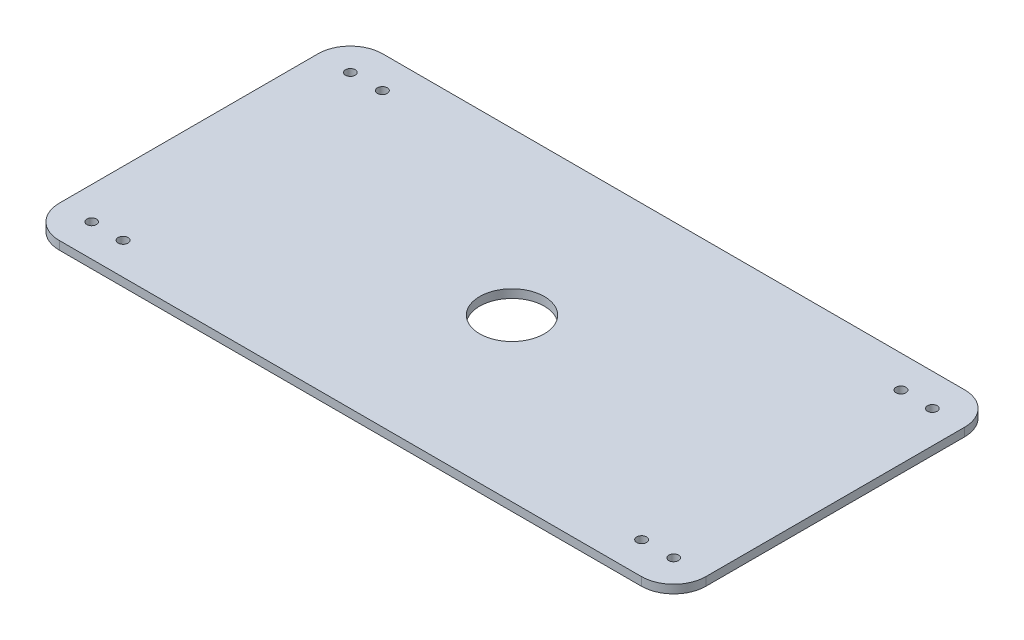
ISO-10303-21;
HEADER;
FILE_DESCRIPTION(('STEP AP214'),'2;1');
FILE_NAME('part.step','',(''),(''),'','','');
FILE_SCHEMA(('AUTOMOTIVE_DESIGN { 1 0 10303 214 1 1 1 1 }'));
ENDSEC;
DATA;
#1=APPLICATION_CONTEXT('core data for automotive mechanical design processes');
#2=APPLICATION_PROTOCOL_DEFINITION('international standard','automotive_design',2000,#1);
#3=PRODUCT_CONTEXT('',#1,'mechanical');
#4=PRODUCT('Part','Part','',(#3));
#5=PRODUCT_RELATED_PRODUCT_CATEGORY('part','',(#4));
#6=PRODUCT_DEFINITION_FORMATION('','',#4);
#7=PRODUCT_DEFINITION_CONTEXT('part definition',#1,'design');
#8=PRODUCT_DEFINITION('design','',#6,#7);
#9=PRODUCT_DEFINITION_SHAPE('','',#8);
#10=(LENGTH_UNIT() NAMED_UNIT(*) SI_UNIT(.MILLI.,.METRE.));
#11=(NAMED_UNIT(*) PLANE_ANGLE_UNIT() SI_UNIT($,.RADIAN.));
#12=(NAMED_UNIT(*) SI_UNIT($,.STERADIAN.) SOLID_ANGLE_UNIT());
#13=UNCERTAINTY_MEASURE_WITH_UNIT(LENGTH_MEASURE(1.E-05),#10,'distance_accuracy_value','');
#14=(GEOMETRIC_REPRESENTATION_CONTEXT(3) GLOBAL_UNCERTAINTY_ASSIGNED_CONTEXT((#13)) GLOBAL_UNIT_ASSIGNED_CONTEXT((#10,
#11,#12)) REPRESENTATION_CONTEXT('',''));
#15=CARTESIAN_POINT('',(0.,0.,0.));
#16=DIRECTION('',(0.,0.,1.));
#17=DIRECTION('',(1.,0.,0.));
#18=AXIS2_PLACEMENT_3D('',#15,#16,#17);
#19=CARTESIAN_POINT('',(0.,2.6,0.));
#20=DIRECTION('',(1.,0.,0.));
#21=DIRECTION('',(0.,0.,-1.));
#22=AXIS2_PLACEMENT_3D('',#19,#20,#21);
#23=PLANE('',#22);
#24=DIRECTION('',(0.,0.,1.));
#25=VECTOR('',#24,1.);
#26=CARTESIAN_POINT('',(0.,2.6,0.));
#27=LINE('',#26,#25);
#28=CARTESIAN_POINT('',(0.,2.6,10.));
#29=VERTEX_POINT('',#28);
#30=CARTESIAN_POINT('',(0.,2.6,90.));
#31=VERTEX_POINT('',#30);
#32=EDGE_CURVE('E120',#29,#31,#27,.T.);
#33=ORIENTED_EDGE('',*,*,#32,.F.);
#34=DIRECTION('',(0.,-1.,0.));
#35=VECTOR('',#34,1.);
#36=CARTESIAN_POINT('',(0.,0.,10.));
#37=LINE('',#36,#35);
#38=CARTESIAN_POINT('',(0.,0.,10.));
#39=VERTEX_POINT('',#38);
#40=EDGE_CURVE('E105',#29,#39,#37,.T.);
#41=ORIENTED_EDGE('',*,*,#40,.T.);
#42=DIRECTION('',(0.,0.,1.));
#43=VECTOR('',#42,1.);
#44=CARTESIAN_POINT('',(0.,0.,0.));
#45=LINE('',#44,#43);
#46=CARTESIAN_POINT('',(0.,0.,90.));
#47=VERTEX_POINT('',#46);
#48=EDGE_CURVE('E117',#39,#47,#45,.T.);
#49=ORIENTED_EDGE('',*,*,#48,.T.);
#50=DIRECTION('',(0.,-1.,0.));
#51=VECTOR('',#50,1.);
#52=CARTESIAN_POINT('',(0.,2.6,90.));
#53=LINE('',#52,#51);
#54=EDGE_CURVE('E122',#47,#31,#53,.F.);
#55=ORIENTED_EDGE('',*,*,#54,.T.);
#56=EDGE_LOOP('',(#33,#41,#49,#55));
#57=FACE_BOUND('',#56,.T.);
#58=ADVANCED_FACE('F35',(#57),#23,.F.);
#59=CARTESIAN_POINT('',(0.,2.6,100.));
#60=DIRECTION('',(0.,0.,-1.));
#61=DIRECTION('',(-1.,0.,0.));
#62=AXIS2_PLACEMENT_3D('',#59,#60,#61);
#63=PLANE('',#62);
#64=DIRECTION('',(1.,0.,0.));
#65=VECTOR('',#64,1.);
#66=CARTESIAN_POINT('',(0.,2.6,100.));
#67=LINE('',#66,#65);
#68=CARTESIAN_POINT('',(10.,2.6,100.));
#69=VERTEX_POINT('',#68);
#70=CARTESIAN_POINT('',(190.,2.6,100.));
#71=VERTEX_POINT('',#70);
#72=EDGE_CURVE('E167',#69,#71,#67,.T.);
#73=ORIENTED_EDGE('',*,*,#72,.F.);
#74=DIRECTION('',(0.,-1.,0.));
#75=VECTOR('',#74,1.);
#76=CARTESIAN_POINT('',(10.,2.6,100.));
#77=LINE('',#76,#75);
#78=CARTESIAN_POINT('',(10.,0.,100.));
#79=VERTEX_POINT('',#78);
#80=EDGE_CURVE('E160',#69,#79,#77,.T.);
#81=ORIENTED_EDGE('',*,*,#80,.T.);
#82=DIRECTION('',(1.,0.,0.));
#83=VECTOR('',#82,1.);
#84=CARTESIAN_POINT('',(0.,0.,100.));
#85=LINE('',#84,#83);
#86=CARTESIAN_POINT('',(190.,0.,100.));
#87=VERTEX_POINT('',#86);
#88=EDGE_CURVE('E126',#79,#87,#85,.T.);
#89=ORIENTED_EDGE('',*,*,#88,.T.);
#90=DIRECTION('',(0.,-1.,0.));
#91=VECTOR('',#90,1.);
#92=CARTESIAN_POINT('',(190.,2.6,100.));
#93=LINE('',#92,#91);
#94=EDGE_CURVE('E158',#87,#71,#93,.F.);
#95=ORIENTED_EDGE('',*,*,#94,.T.);
#96=EDGE_LOOP('',(#73,#81,#89,#95));
#97=FACE_BOUND('',#96,.T.);
#98=ADVANCED_FACE('F165',(#97),#63,.F.);
#99=CARTESIAN_POINT('',(200.,2.6,0.));
#100=DIRECTION('',(1.,0.,0.));
#101=DIRECTION('',(0.,0.,-1.));
#102=AXIS2_PLACEMENT_3D('',#99,#100,#101);
#103=PLANE('',#102);
#104=DIRECTION('',(0.,0.,1.));
#105=VECTOR('',#104,1.);
#106=CARTESIAN_POINT('',(200.,2.6,0.));
#107=LINE('',#106,#105);
#108=CARTESIAN_POINT('',(200.,2.6,10.));
#109=VERTEX_POINT('',#108);
#110=CARTESIAN_POINT('',(200.,2.6,90.));
#111=VERTEX_POINT('',#110);
#112=EDGE_CURVE('E174',#109,#111,#107,.T.);
#113=ORIENTED_EDGE('',*,*,#112,.T.);
#114=DIRECTION('',(0.,-1.,0.));
#115=VECTOR('',#114,1.);
#116=CARTESIAN_POINT('',(200.,0.,90.));
#117=LINE('',#116,#115);
#118=CARTESIAN_POINT('',(200.,0.,90.));
#119=VERTEX_POINT('',#118);
#120=EDGE_CURVE('E11',#111,#119,#117,.T.);
#121=ORIENTED_EDGE('',*,*,#120,.T.);
#122=DIRECTION('',(0.,0.,1.));
#123=VECTOR('',#122,1.);
#124=CARTESIAN_POINT('',(200.,0.,0.));
#125=LINE('',#124,#123);
#126=CARTESIAN_POINT('',(200.,0.,10.));
#127=VERTEX_POINT('',#126);
#128=EDGE_CURVE('E130',#127,#119,#125,.T.);
#129=ORIENTED_EDGE('',*,*,#128,.F.);
#130=DIRECTION('',(0.,-1.,0.));
#131=VECTOR('',#130,1.);
#132=CARTESIAN_POINT('',(200.,2.6,10.));
#133=LINE('',#132,#131);
#134=EDGE_CURVE('E43',#127,#109,#133,.F.);
#135=ORIENTED_EDGE('',*,*,#134,.T.);
#136=EDGE_LOOP('',(#113,#121,#129,#135));
#137=FACE_BOUND('',#136,.T.);
#138=ADVANCED_FACE('F173',(#137),#103,.T.);
#139=CARTESIAN_POINT('',(0.,2.6,0.));
#140=DIRECTION('',(0.,0.,-1.));
#141=DIRECTION('',(-1.,0.,0.));
#142=AXIS2_PLACEMENT_3D('',#139,#140,#141);
#143=PLANE('',#142);
#144=DIRECTION('',(1.,0.,0.));
#145=VECTOR('',#144,1.);
#146=CARTESIAN_POINT('',(0.,0.,0.));
#147=LINE('',#146,#145);
#148=CARTESIAN_POINT('',(10.,0.,0.));
#149=VERTEX_POINT('',#148);
#150=CARTESIAN_POINT('',(190.,0.,0.));
#151=VERTEX_POINT('',#150);
#152=EDGE_CURVE('E141',#149,#151,#147,.T.);
#153=ORIENTED_EDGE('',*,*,#152,.F.);
#154=DIRECTION('',(0.,-1.,0.));
#155=VECTOR('',#154,1.);
#156=CARTESIAN_POINT('',(10.,2.6,0.));
#157=LINE('',#156,#155);
#158=CARTESIAN_POINT('',(10.,2.6,0.));
#159=VERTEX_POINT('',#158);
#160=EDGE_CURVE('E106',#149,#159,#157,.F.);
#161=ORIENTED_EDGE('',*,*,#160,.T.);
#162=DIRECTION('',(1.,0.,0.));
#163=VECTOR('',#162,1.);
#164=CARTESIAN_POINT('',(0.,2.6,0.));
#165=LINE('',#164,#163);
#166=CARTESIAN_POINT('',(190.,2.6,0.));
#167=VERTEX_POINT('',#166);
#168=EDGE_CURVE('E136',#159,#167,#165,.T.);
#169=ORIENTED_EDGE('',*,*,#168,.T.);
#170=DIRECTION('',(0.,-1.,0.));
#171=VECTOR('',#170,1.);
#172=CARTESIAN_POINT('',(190.,2.6,0.));
#173=LINE('',#172,#171);
#174=EDGE_CURVE('E111',#167,#151,#173,.T.);
#175=ORIENTED_EDGE('',*,*,#174,.T.);
#176=EDGE_LOOP('',(#153,#161,#169,#175));
#177=FACE_BOUND('',#176,.T.);
#178=ADVANCED_FACE('F361',(#177),#143,.T.);
#179=CARTESIAN_POINT('',(0.,2.6,0.));
#180=DIRECTION('',(0.,1.,0.));
#181=DIRECTION('',(0.,0.,1.));
#182=AXIS2_PLACEMENT_3D('',#179,#180,#181);
#183=PLANE('',#182);
#184=CARTESIAN_POINT('',(19.812,2.6,90.094));
#185=DIRECTION('',(0.,-1.,0.));
#186=DIRECTION('',(0.,0.,-1.));
#187=AXIS2_PLACEMENT_3D('',#184,#185,#186);
#188=CIRCLE('',#187,1.524);
#189=CARTESIAN_POINT('',(19.812,2.6,88.57));
#190=VERTEX_POINT('',#189);
#191=EDGE_CURVE('E225',#190,#190,#188,.T.);
#192=ORIENTED_EDGE('',*,*,#191,.T.);
#193=EDGE_LOOP('',(#192));
#194=FACE_BOUND('',#193,.T.);
#195=CARTESIAN_POINT('',(180.188,2.6,90.094));
#196=DIRECTION('',(0.,1.,0.));
#197=DIRECTION('',(0.,0.,-1.));
#198=AXIS2_PLACEMENT_3D('',#195,#196,#197);
#199=CIRCLE('',#198,1.524);
#200=CARTESIAN_POINT('',(180.188,2.6,88.57));
#201=VERTEX_POINT('',#200);
#202=EDGE_CURVE('E219',#201,#201,#199,.T.);
#203=ORIENTED_EDGE('',*,*,#202,.F.);
#204=EDGE_LOOP('',(#203));
#205=FACE_BOUND('',#204,.T.);
#206=CARTESIAN_POINT('',(180.188,2.6,9.90599999999999));
#207=DIRECTION('',(0.,-1.,0.));
#208=DIRECTION('',(0.,0.,1.));
#209=AXIS2_PLACEMENT_3D('',#206,#207,#208);
#210=CIRCLE('',#209,1.524);
#211=CARTESIAN_POINT('',(180.188,2.6,11.43));
#212=VERTEX_POINT('',#211);
#213=EDGE_CURVE('E213',#212,#212,#210,.T.);
#214=ORIENTED_EDGE('',*,*,#213,.T.);
#215=EDGE_LOOP('',(#214));
#216=FACE_BOUND('',#215,.T.);
#217=CARTESIAN_POINT('',(19.812,2.6,9.906));
#218=DIRECTION('',(0.,1.,0.));
#219=DIRECTION('',(0.,0.,1.));
#220=AXIS2_PLACEMENT_3D('',#217,#218,#219);
#221=CIRCLE('',#220,1.524);
#222=CARTESIAN_POINT('',(19.812,2.6,11.43));
#223=VERTEX_POINT('',#222);
#224=EDGE_CURVE('E207',#223,#223,#221,.T.);
#225=ORIENTED_EDGE('',*,*,#224,.F.);
#226=EDGE_LOOP('',(#225));
#227=FACE_BOUND('',#226,.T.);
#228=CARTESIAN_POINT('',(100.,2.6,50.));
#229=DIRECTION('',(0.,-1.,0.));
#230=DIRECTION('',(0.,0.,-1.));
#231=AXIS2_PLACEMENT_3D('',#228,#229,#230);
#232=CIRCLE('',#231,9.99999999999999);
#233=CARTESIAN_POINT('',(100.,2.6,40.));
#234=VERTEX_POINT('',#233);
#235=EDGE_CURVE('E198',#234,#234,#232,.T.);
#236=ORIENTED_EDGE('',*,*,#235,.T.);
#237=EDGE_LOOP('',(#236));
#238=FACE_BOUND('',#237,.T.);
#239=CARTESIAN_POINT('',(190.,2.6,90.));
#240=DIRECTION('',(0.,1.,0.));
#241=DIRECTION('',(0.,0.,1.));
#242=AXIS2_PLACEMENT_3D('',#239,#240,#241);
#243=CIRCLE('',#242,1.5);
#244=CARTESIAN_POINT('',(190.,2.6,91.5));
#245=VERTEX_POINT('',#244);
#246=EDGE_CURVE('E192',#245,#245,#243,.T.);
#247=ORIENTED_EDGE('',*,*,#246,.F.);
#248=EDGE_LOOP('',(#247));
#249=FACE_BOUND('',#248,.T.);
#250=CARTESIAN_POINT('',(10.,2.6,90.));
#251=DIRECTION('',(0.,-1.,0.));
#252=DIRECTION('',(0.,0.,1.));
#253=AXIS2_PLACEMENT_3D('',#250,#251,#252);
#254=CIRCLE('',#253,1.5);
#255=CARTESIAN_POINT('',(10.,2.6,91.5));
#256=VERTEX_POINT('',#255);
#257=EDGE_CURVE('E186',#256,#256,#254,.T.);
#258=ORIENTED_EDGE('',*,*,#257,.T.);
#259=EDGE_LOOP('',(#258));
#260=FACE_BOUND('',#259,.T.);
#261=CARTESIAN_POINT('',(10.,2.6,10.));
#262=DIRECTION('',(0.,1.,0.));
#263=DIRECTION('',(0.,0.,-1.));
#264=AXIS2_PLACEMENT_3D('',#261,#262,#263);
#265=CIRCLE('',#264,1.5);
#266=CARTESIAN_POINT('',(10.,2.6,8.50000000000001));
#267=VERTEX_POINT('',#266);
#268=EDGE_CURVE('E181',#267,#267,#265,.T.);
#269=ORIENTED_EDGE('',*,*,#268,.F.);
#270=EDGE_LOOP('',(#269));
#271=FACE_BOUND('',#270,.T.);
#272=CARTESIAN_POINT('',(190.,2.6,10.));
#273=DIRECTION('',(0.,-1.,0.));
#274=DIRECTION('',(0.,0.,-1.));
#275=AXIS2_PLACEMENT_3D('',#272,#273,#274);
#276=CIRCLE('',#275,1.5);
#277=CARTESIAN_POINT('',(190.,2.6,8.5));
#278=VERTEX_POINT('',#277);
#279=EDGE_CURVE('E127',#278,#278,#276,.T.);
#280=ORIENTED_EDGE('',*,*,#279,.T.);
#281=EDGE_LOOP('',(#280));
#282=FACE_BOUND('',#281,.T.);
#283=ORIENTED_EDGE('',*,*,#168,.F.);
#284=CARTESIAN_POINT('',(10.,2.6,10.));
#285=DIRECTION('',(0.,1.,0.));
#286=DIRECTION('',(0.,0.,1.));
#287=AXIS2_PLACEMENT_3D('',#284,#285,#286);
#288=CIRCLE('',#287,10.);
#289=EDGE_CURVE('E156',#159,#29,#288,.T.);
#290=ORIENTED_EDGE('',*,*,#289,.T.);
#291=ORIENTED_EDGE('',*,*,#32,.T.);
#292=CARTESIAN_POINT('',(10.,2.6,90.));
#293=DIRECTION('',(0.,1.,0.));
#294=DIRECTION('',(0.,0.,1.));
#295=AXIS2_PLACEMENT_3D('',#292,#293,#294);
#296=CIRCLE('',#295,10.);
#297=EDGE_CURVE('E154',#31,#69,#296,.T.);
#298=ORIENTED_EDGE('',*,*,#297,.T.);
#299=ORIENTED_EDGE('',*,*,#72,.T.);
#300=CARTESIAN_POINT('',(190.,2.6,90.));
#301=DIRECTION('',(0.,1.,0.));
#302=DIRECTION('',(0.,0.,1.));
#303=AXIS2_PLACEMENT_3D('',#300,#301,#302);
#304=CIRCLE('',#303,10.);
#305=EDGE_CURVE('E50',#71,#111,#304,.T.);
#306=ORIENTED_EDGE('',*,*,#305,.T.);
#307=ORIENTED_EDGE('',*,*,#112,.F.);
#308=CARTESIAN_POINT('',(190.,2.6,10.));
#309=DIRECTION('',(0.,1.,0.));
#310=DIRECTION('',(0.,0.,1.));
#311=AXIS2_PLACEMENT_3D('',#308,#309,#310);
#312=CIRCLE('',#311,10.);
#313=EDGE_CURVE('E151',#109,#167,#312,.T.);
#314=ORIENTED_EDGE('',*,*,#313,.T.);
#315=EDGE_LOOP('',(#283,#290,#291,#298,#299,#306,#307,#314));
#316=FACE_BOUND('',#315,.T.);
#317=ADVANCED_FACE('F236',(#194,#205,#216,#227,#238,#249,#260,#271,#282,#316),#183,.T.);
#318=CARTESIAN_POINT('',(0.,0.,0.));
#319=DIRECTION('',(0.,1.,0.));
#320=DIRECTION('',(0.,0.,1.));
#321=AXIS2_PLACEMENT_3D('',#318,#319,#320);
#322=PLANE('',#321);
#323=CARTESIAN_POINT('',(19.812,1.19999999954185E-07,90.094));
#324=DIRECTION('',(0.,-1.,0.));
#325=DIRECTION('',(0.,0.,-1.));
#326=AXIS2_PLACEMENT_3D('',#323,#324,#325);
#327=CIRCLE('',#326,1.524);
#328=CARTESIAN_POINT('',(19.812,1.19999999954185E-07,88.57));
#329=VERTEX_POINT('',#328);
#330=EDGE_CURVE('E222',#329,#329,#327,.T.);
#331=ORIENTED_EDGE('',*,*,#330,.F.);
#332=EDGE_LOOP('',(#331));
#333=FACE_BOUND('',#332,.T.);
#334=CARTESIAN_POINT('',(180.188,1.19999999954185E-07,90.094));
#335=DIRECTION('',(0.,1.,0.));
#336=DIRECTION('',(0.,0.,-1.));
#337=AXIS2_PLACEMENT_3D('',#334,#335,#336);
#338=CIRCLE('',#337,1.524);
#339=CARTESIAN_POINT('',(180.188,1.19999999954185E-07,88.57));
#340=VERTEX_POINT('',#339);
#341=EDGE_CURVE('E216',#340,#340,#338,.T.);
#342=ORIENTED_EDGE('',*,*,#341,.T.);
#343=EDGE_LOOP('',(#342));
#344=FACE_BOUND('',#343,.T.);
#345=CARTESIAN_POINT('',(180.188,1.19999999954185E-07,9.90599999999999));
#346=DIRECTION('',(0.,-1.,0.));
#347=DIRECTION('',(0.,0.,1.));
#348=AXIS2_PLACEMENT_3D('',#345,#346,#347);
#349=CIRCLE('',#348,1.524);
#350=CARTESIAN_POINT('',(180.188,1.19999999954185E-07,11.43));
#351=VERTEX_POINT('',#350);
#352=EDGE_CURVE('E210',#351,#351,#349,.T.);
#353=ORIENTED_EDGE('',*,*,#352,.F.);
#354=EDGE_LOOP('',(#353));
#355=FACE_BOUND('',#354,.T.);
#356=CARTESIAN_POINT('',(19.812,1.19999999954185E-07,9.906));
#357=DIRECTION('',(0.,1.,0.));
#358=DIRECTION('',(0.,0.,1.));
#359=AXIS2_PLACEMENT_3D('',#356,#357,#358);
#360=CIRCLE('',#359,1.524);
#361=CARTESIAN_POINT('',(19.812,1.19999999954185E-07,11.43));
#362=VERTEX_POINT('',#361);
#363=EDGE_CURVE('E204',#362,#362,#360,.T.);
#364=ORIENTED_EDGE('',*,*,#363,.T.);
#365=EDGE_LOOP('',(#364));
#366=FACE_BOUND('',#365,.T.);
#367=CARTESIAN_POINT('',(100.,0.,50.));
#368=DIRECTION('',(0.,-1.,0.));
#369=DIRECTION('',(0.,0.,-1.));
#370=AXIS2_PLACEMENT_3D('',#367,#368,#369);
#371=CIRCLE('',#370,9.99999999999999);
#372=CARTESIAN_POINT('',(100.,0.,40.));
#373=VERTEX_POINT('',#372);
#374=EDGE_CURVE('E201',#373,#373,#371,.T.);
#375=ORIENTED_EDGE('',*,*,#374,.F.);
#376=EDGE_LOOP('',(#375));
#377=FACE_BOUND('',#376,.T.);
#378=CARTESIAN_POINT('',(190.,0.,90.));
#379=DIRECTION('',(0.,1.,0.));
#380=DIRECTION('',(0.,0.,1.));
#381=AXIS2_PLACEMENT_3D('',#378,#379,#380);
#382=CIRCLE('',#381,1.5);
#383=CARTESIAN_POINT('',(190.,0.,91.5));
#384=VERTEX_POINT('',#383);
#385=EDGE_CURVE('E195',#384,#384,#382,.T.);
#386=ORIENTED_EDGE('',*,*,#385,.T.);
#387=EDGE_LOOP('',(#386));
#388=FACE_BOUND('',#387,.T.);
#389=CARTESIAN_POINT('',(10.,0.,90.));
#390=DIRECTION('',(0.,-1.,0.));
#391=DIRECTION('',(0.,0.,1.));
#392=AXIS2_PLACEMENT_3D('',#389,#390,#391);
#393=CIRCLE('',#392,1.5);
#394=CARTESIAN_POINT('',(10.,0.,91.5));
#395=VERTEX_POINT('',#394);
#396=EDGE_CURVE('E189',#395,#395,#393,.T.);
#397=ORIENTED_EDGE('',*,*,#396,.F.);
#398=EDGE_LOOP('',(#397));
#399=FACE_BOUND('',#398,.T.);
#400=CARTESIAN_POINT('',(10.,0.,10.));
#401=DIRECTION('',(0.,1.,0.));
#402=DIRECTION('',(0.,0.,-1.));
#403=AXIS2_PLACEMENT_3D('',#400,#401,#402);
#404=CIRCLE('',#403,1.5);
#405=CARTESIAN_POINT('',(10.,0.,8.50000000000001));
#406=VERTEX_POINT('',#405);
#407=EDGE_CURVE('E183',#406,#406,#404,.T.);
#408=ORIENTED_EDGE('',*,*,#407,.T.);
#409=EDGE_LOOP('',(#408));
#410=FACE_BOUND('',#409,.T.);
#411=CARTESIAN_POINT('',(190.,0.,10.));
#412=DIRECTION('',(0.,-1.,0.));
#413=DIRECTION('',(0.,0.,-1.));
#414=AXIS2_PLACEMENT_3D('',#411,#412,#413);
#415=CIRCLE('',#414,1.5);
#416=CARTESIAN_POINT('',(190.,0.,8.5));
#417=VERTEX_POINT('',#416);
#418=EDGE_CURVE('E133',#417,#417,#415,.T.);
#419=ORIENTED_EDGE('',*,*,#418,.F.);
#420=EDGE_LOOP('',(#419));
#421=FACE_BOUND('',#420,.T.);
#422=ORIENTED_EDGE('',*,*,#48,.F.);
#423=CARTESIAN_POINT('',(10.,0.,10.));
#424=DIRECTION('',(0.,1.,0.));
#425=DIRECTION('',(0.,0.,1.));
#426=AXIS2_PLACEMENT_3D('',#423,#424,#425);
#427=CIRCLE('',#426,10.);
#428=EDGE_CURVE('E101',#39,#149,#427,.F.);
#429=ORIENTED_EDGE('',*,*,#428,.T.);
#430=ORIENTED_EDGE('',*,*,#152,.T.);
#431=CARTESIAN_POINT('',(190.,0.,10.));
#432=DIRECTION('',(0.,1.,0.));
#433=DIRECTION('',(0.,0.,1.));
#434=AXIS2_PLACEMENT_3D('',#431,#432,#433);
#435=CIRCLE('',#434,10.);
#436=EDGE_CURVE('E121',#151,#127,#435,.F.);
#437=ORIENTED_EDGE('',*,*,#436,.T.);
#438=ORIENTED_EDGE('',*,*,#128,.T.);
#439=CARTESIAN_POINT('',(190.,0.,90.));
#440=DIRECTION('',(0.,1.,0.));
#441=DIRECTION('',(0.,0.,1.));
#442=AXIS2_PLACEMENT_3D('',#439,#440,#441);
#443=CIRCLE('',#442,10.);
#444=EDGE_CURVE('E145',#119,#87,#443,.F.);
#445=ORIENTED_EDGE('',*,*,#444,.T.);
#446=ORIENTED_EDGE('',*,*,#88,.F.);
#447=CARTESIAN_POINT('',(10.,0.,90.));
#448=DIRECTION('',(0.,1.,0.));
#449=DIRECTION('',(0.,0.,1.));
#450=AXIS2_PLACEMENT_3D('',#447,#448,#449);
#451=CIRCLE('',#450,10.);
#452=EDGE_CURVE('E112',#79,#47,#451,.F.);
#453=ORIENTED_EDGE('',*,*,#452,.T.);
#454=EDGE_LOOP('',(#422,#429,#430,#437,#438,#445,#446,#453));
#455=FACE_BOUND('',#454,.T.);
#456=ADVANCED_FACE('F124',(#333,#344,#355,#366,#377,#388,#399,#410,#421,#455),#322,.F.);
#457=CARTESIAN_POINT('',(10.,2.6,10.));
#458=DIRECTION('',(0.,1.,0.));
#459=DIRECTION('',(0.,0.,1.));
#460=AXIS2_PLACEMENT_3D('',#457,#458,#459);
#461=CYLINDRICAL_SURFACE('',#460,10.);
#462=ORIENTED_EDGE('',*,*,#289,.F.);
#463=ORIENTED_EDGE('',*,*,#160,.F.);
#464=ORIENTED_EDGE('',*,*,#428,.F.);
#465=ORIENTED_EDGE('',*,*,#40,.F.);
#466=EDGE_LOOP('',(#462,#463,#464,#465));
#467=FACE_BOUND('',#466,.T.);
#468=ADVANCED_FACE('F104',(#467),#461,.T.);
#469=CARTESIAN_POINT('',(10.,2.6,90.));
#470=DIRECTION('',(0.,-1.,0.));
#471=DIRECTION('',(0.,0.,-1.));
#472=AXIS2_PLACEMENT_3D('',#469,#470,#471);
#473=CYLINDRICAL_SURFACE('',#472,10.);
#474=ORIENTED_EDGE('',*,*,#297,.F.);
#475=ORIENTED_EDGE('',*,*,#54,.F.);
#476=ORIENTED_EDGE('',*,*,#452,.F.);
#477=ORIENTED_EDGE('',*,*,#80,.F.);
#478=EDGE_LOOP('',(#474,#475,#476,#477));
#479=FACE_BOUND('',#478,.T.);
#480=ADVANCED_FACE('F279',(#479),#473,.T.);
#481=CARTESIAN_POINT('',(190.,2.6,90.));
#482=DIRECTION('',(0.,1.,0.));
#483=DIRECTION('',(0.,0.,1.));
#484=AXIS2_PLACEMENT_3D('',#481,#482,#483);
#485=CYLINDRICAL_SURFACE('',#484,10.);
#486=ORIENTED_EDGE('',*,*,#305,.F.);
#487=ORIENTED_EDGE('',*,*,#94,.F.);
#488=ORIENTED_EDGE('',*,*,#444,.F.);
#489=ORIENTED_EDGE('',*,*,#120,.F.);
#490=EDGE_LOOP('',(#486,#487,#488,#489));
#491=FACE_BOUND('',#490,.T.);
#492=ADVANCED_FACE('F172',(#491),#485,.T.);
#493=CARTESIAN_POINT('',(190.,2.6,10.));
#494=DIRECTION('',(0.,-1.,0.));
#495=DIRECTION('',(0.,0.,-1.));
#496=AXIS2_PLACEMENT_3D('',#493,#494,#495);
#497=CYLINDRICAL_SURFACE('',#496,10.);
#498=ORIENTED_EDGE('',*,*,#313,.F.);
#499=ORIENTED_EDGE('',*,*,#134,.F.);
#500=ORIENTED_EDGE('',*,*,#436,.F.);
#501=ORIENTED_EDGE('',*,*,#174,.F.);
#502=EDGE_LOOP('',(#498,#499,#500,#501));
#503=FACE_BOUND('',#502,.T.);
#504=ADVANCED_FACE('F37',(#503),#497,.T.);
#505=CARTESIAN_POINT('',(190.,2.6,10.));
#506=DIRECTION('',(0.,-1.,0.));
#507=DIRECTION('',(0.,0.,-1.));
#508=AXIS2_PLACEMENT_3D('',#505,#506,#507);
#509=CYLINDRICAL_SURFACE('',#508,1.5);
#510=ORIENTED_EDGE('',*,*,#279,.F.);
#511=EDGE_LOOP('',(#510));
#512=FACE_BOUND('',#511,.T.);
#513=ORIENTED_EDGE('',*,*,#418,.T.);
#514=EDGE_LOOP('',(#513));
#515=FACE_BOUND('',#514,.T.);
#516=ADVANCED_FACE('F254',(#512,#515),#509,.F.);
#517=CARTESIAN_POINT('',(10.,2.6,10.));
#518=DIRECTION('',(0.,-1.,0.));
#519=DIRECTION('',(0.,0.,-1.));
#520=AXIS2_PLACEMENT_3D('',#517,#518,#519);
#521=CYLINDRICAL_SURFACE('',#520,1.5);
#522=ORIENTED_EDGE('',*,*,#268,.T.);
#523=EDGE_LOOP('',(#522));
#524=FACE_BOUND('',#523,.T.);
#525=ORIENTED_EDGE('',*,*,#407,.F.);
#526=EDGE_LOOP('',(#525));
#527=FACE_BOUND('',#526,.T.);
#528=ADVANCED_FACE('F256',(#524,#527),#521,.F.);
#529=CARTESIAN_POINT('',(10.,2.6,90.));
#530=DIRECTION('',(0.,-1.,0.));
#531=DIRECTION('',(0.,0.,-1.));
#532=AXIS2_PLACEMENT_3D('',#529,#530,#531);
#533=CYLINDRICAL_SURFACE('',#532,1.5);
#534=ORIENTED_EDGE('',*,*,#257,.F.);
#535=EDGE_LOOP('',(#534));
#536=FACE_BOUND('',#535,.T.);
#537=ORIENTED_EDGE('',*,*,#396,.T.);
#538=EDGE_LOOP('',(#537));
#539=FACE_BOUND('',#538,.T.);
#540=ADVANCED_FACE('F263',(#536,#539),#533,.F.);
#541=CARTESIAN_POINT('',(190.,2.6,90.));
#542=DIRECTION('',(0.,-1.,0.));
#543=DIRECTION('',(0.,0.,-1.));
#544=AXIS2_PLACEMENT_3D('',#541,#542,#543);
#545=CYLINDRICAL_SURFACE('',#544,1.5);
#546=ORIENTED_EDGE('',*,*,#246,.T.);
#547=EDGE_LOOP('',(#546));
#548=FACE_BOUND('',#547,.T.);
#549=ORIENTED_EDGE('',*,*,#385,.F.);
#550=EDGE_LOOP('',(#549));
#551=FACE_BOUND('',#550,.T.);
#552=ADVANCED_FACE('F309',(#548,#551),#545,.F.);
#553=CARTESIAN_POINT('',(100.,2.6,50.));
#554=DIRECTION('',(0.,-1.,0.));
#555=DIRECTION('',(0.,0.,-1.));
#556=AXIS2_PLACEMENT_3D('',#553,#554,#555);
#557=CYLINDRICAL_SURFACE('',#556,9.99999999999999);
#558=ORIENTED_EDGE('',*,*,#235,.F.);
#559=EDGE_LOOP('',(#558));
#560=FACE_BOUND('',#559,.T.);
#561=ORIENTED_EDGE('',*,*,#374,.T.);
#562=EDGE_LOOP('',(#561));
#563=FACE_BOUND('',#562,.T.);
#564=ADVANCED_FACE('F319',(#560,#563),#557,.F.);
#565=CARTESIAN_POINT('',(19.812,1.19999999954185E-07,9.906));
#566=DIRECTION('',(0.,1.,0.));
#567=DIRECTION('',(0.,0.,1.));
#568=AXIS2_PLACEMENT_3D('',#565,#566,#567);
#569=CYLINDRICAL_SURFACE('',#568,1.524);
#570=ORIENTED_EDGE('',*,*,#363,.F.);
#571=EDGE_LOOP('',(#570));
#572=FACE_BOUND('',#571,.T.);
#573=ORIENTED_EDGE('',*,*,#224,.T.);
#574=EDGE_LOOP('',(#573));
#575=FACE_BOUND('',#574,.T.);
#576=ADVANCED_FACE('F329',(#572,#575),#569,.F.);
#577=CARTESIAN_POINT('',(180.188,1.19999999954185E-07,9.90599999999999));
#578=DIRECTION('',(0.,1.,0.));
#579=DIRECTION('',(0.,0.,1.));
#580=AXIS2_PLACEMENT_3D('',#577,#578,#579);
#581=CYLINDRICAL_SURFACE('',#580,1.524);
#582=ORIENTED_EDGE('',*,*,#352,.T.);
#583=EDGE_LOOP('',(#582));
#584=FACE_BOUND('',#583,.T.);
#585=ORIENTED_EDGE('',*,*,#213,.F.);
#586=EDGE_LOOP('',(#585));
#587=FACE_BOUND('',#586,.T.);
#588=ADVANCED_FACE('F339',(#584,#587),#581,.F.);
#589=CARTESIAN_POINT('',(180.188,1.19999999954185E-07,90.094));
#590=DIRECTION('',(0.,1.,0.));
#591=DIRECTION('',(0.,0.,1.));
#592=AXIS2_PLACEMENT_3D('',#589,#590,#591);
#593=CYLINDRICAL_SURFACE('',#592,1.524);
#594=ORIENTED_EDGE('',*,*,#341,.F.);
#595=EDGE_LOOP('',(#594));
#596=FACE_BOUND('',#595,.T.);
#597=ORIENTED_EDGE('',*,*,#202,.T.);
#598=EDGE_LOOP('',(#597));
#599=FACE_BOUND('',#598,.T.);
#600=ADVANCED_FACE('F349',(#596,#599),#593,.F.);
#601=CARTESIAN_POINT('',(19.812,1.19999999954185E-07,90.094));
#602=DIRECTION('',(0.,1.,0.));
#603=DIRECTION('',(0.,0.,1.));
#604=AXIS2_PLACEMENT_3D('',#601,#602,#603);
#605=CYLINDRICAL_SURFACE('',#604,1.524);
#606=ORIENTED_EDGE('',*,*,#330,.T.);
#607=EDGE_LOOP('',(#606));
#608=FACE_BOUND('',#607,.T.);
#609=ORIENTED_EDGE('',*,*,#191,.F.);
#610=EDGE_LOOP('',(#609));
#611=FACE_BOUND('',#610,.T.);
#612=ADVANCED_FACE('F231',(#608,#611),#605,.F.);
#613=CLOSED_SHELL('',(#58,#98,#138,#178,#317,#456,#468,#480,#492,#504,#516,#528,#540,#552,#564,
#576,#588,#600,#612));
#614=MANIFOLD_SOLID_BREP('B2',#613);
#615=ADVANCED_BREP_SHAPE_REPRESENTATION('',(#18,#614),#14);
#616=SHAPE_DEFINITION_REPRESENTATION(#9,#615);
ENDSEC;
END-ISO-10303-21;
